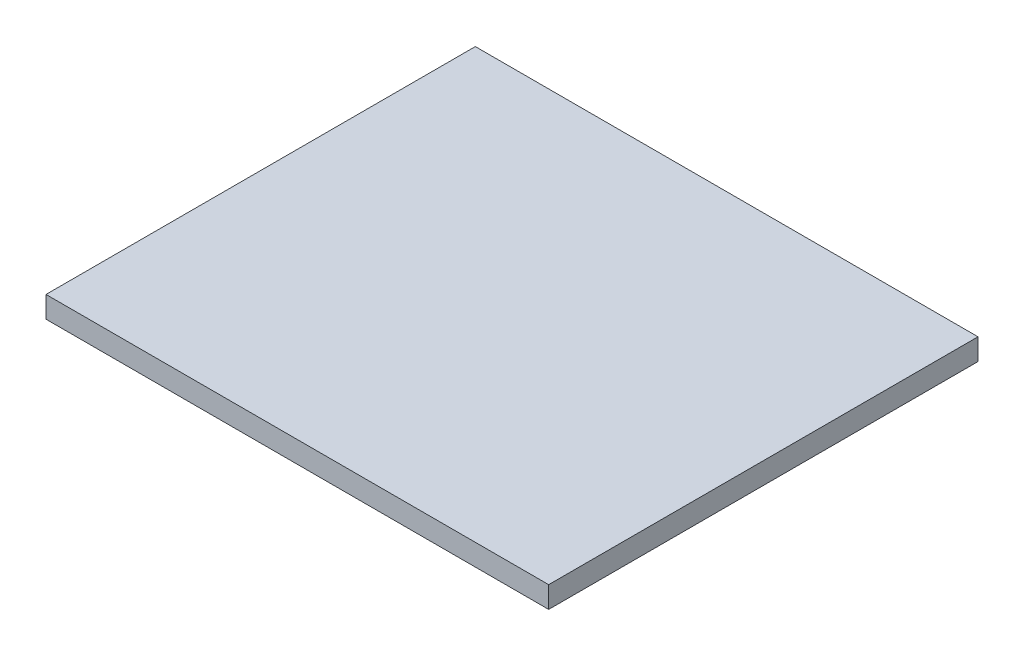
ISO-10303-21;
HEADER;
FILE_DESCRIPTION(('STEP AP214'),'2;1');
FILE_NAME('part.step','',(''),(''),'','','');
FILE_SCHEMA(('AUTOMOTIVE_DESIGN { 1 0 10303 214 1 1 1 1 }'));
ENDSEC;
DATA;
#1=APPLICATION_CONTEXT('core data for automotive mechanical design processes');
#2=APPLICATION_PROTOCOL_DEFINITION('international standard','automotive_design',2000,#1);
#3=PRODUCT_CONTEXT('',#1,'mechanical');
#4=PRODUCT('Part','Part','',(#3));
#5=PRODUCT_RELATED_PRODUCT_CATEGORY('part','',(#4));
#6=PRODUCT_DEFINITION_FORMATION('','',#4);
#7=PRODUCT_DEFINITION_CONTEXT('part definition',#1,'design');
#8=PRODUCT_DEFINITION('design','',#6,#7);
#9=PRODUCT_DEFINITION_SHAPE('','',#8);
#10=(LENGTH_UNIT() NAMED_UNIT(*) SI_UNIT(.MILLI.,.METRE.));
#11=(NAMED_UNIT(*) PLANE_ANGLE_UNIT() SI_UNIT($,.RADIAN.));
#12=(NAMED_UNIT(*) SI_UNIT($,.STERADIAN.) SOLID_ANGLE_UNIT());
#13=UNCERTAINTY_MEASURE_WITH_UNIT(LENGTH_MEASURE(1.E-05),#10,'distance_accuracy_value','');
#14=(GEOMETRIC_REPRESENTATION_CONTEXT(3) GLOBAL_UNCERTAINTY_ASSIGNED_CONTEXT((#13)) GLOBAL_UNIT_ASSIGNED_CONTEXT((#10,
#11,#12)) REPRESENTATION_CONTEXT('',''));
#15=CARTESIAN_POINT('',(0.,0.,0.));
#16=DIRECTION('',(0.,0.,1.));
#17=DIRECTION('',(1.,0.,0.));
#18=AXIS2_PLACEMENT_3D('',#15,#16,#17);
#19=CARTESIAN_POINT('',(140.5,12.,120.));
#20=DIRECTION('',(-1.,0.,0.));
#21=DIRECTION('',(0.,0.,1.));
#22=AXIS2_PLACEMENT_3D('',#19,#20,#21);
#23=PLANE('',#22);
#24=DIRECTION('',(0.,0.,-1.));
#25=VECTOR('',#24,1.);
#26=CARTESIAN_POINT('',(140.5,0.,120.));
#27=LINE('',#26,#25);
#28=CARTESIAN_POINT('',(140.5,0.,120.));
#29=VERTEX_POINT('',#28);
#30=CARTESIAN_POINT('',(140.5,0.,-120.));
#31=VERTEX_POINT('',#30);
#32=EDGE_CURVE('E97',#29,#31,#27,.T.);
#33=ORIENTED_EDGE('',*,*,#32,.T.);
#34=DIRECTION('',(0.,-1.,0.));
#35=VECTOR('',#34,1.);
#36=CARTESIAN_POINT('',(140.5,12.,-120.));
#37=LINE('',#36,#35);
#38=CARTESIAN_POINT('',(140.5,12.,-120.));
#39=VERTEX_POINT('',#38);
#40=EDGE_CURVE('E11',#39,#31,#37,.T.);
#41=ORIENTED_EDGE('',*,*,#40,.F.);
#42=DIRECTION('',(0.,0.,-1.));
#43=VECTOR('',#42,1.);
#44=CARTESIAN_POINT('',(140.5,12.,120.));
#45=LINE('',#44,#43);
#46=CARTESIAN_POINT('',(140.5,12.,120.));
#47=VERTEX_POINT('',#46);
#48=EDGE_CURVE('E85',#47,#39,#45,.T.);
#49=ORIENTED_EDGE('',*,*,#48,.F.);
#50=DIRECTION('',(0.,-1.,0.));
#51=VECTOR('',#50,1.);
#52=CARTESIAN_POINT('',(140.5,12.,120.));
#53=LINE('',#52,#51);
#54=EDGE_CURVE('E93',#47,#29,#53,.T.);
#55=ORIENTED_EDGE('',*,*,#54,.T.);
#56=EDGE_LOOP('',(#33,#41,#49,#55));
#57=FACE_BOUND('',#56,.T.);
#58=ADVANCED_FACE('F34',(#57),#23,.F.);
#59=CARTESIAN_POINT('',(-140.5,12.,-120.));
#60=DIRECTION('',(0.,0.,1.));
#61=DIRECTION('',(1.,0.,0.));
#62=AXIS2_PLACEMENT_3D('',#59,#60,#61);
#63=PLANE('',#62);
#64=DIRECTION('',(-1.,0.,0.));
#65=VECTOR('',#64,1.);
#66=CARTESIAN_POINT('',(-140.5,0.,-120.));
#67=LINE('',#66,#65);
#68=CARTESIAN_POINT('',(-140.5,0.,-120.));
#69=VERTEX_POINT('',#68);
#70=EDGE_CURVE('E89',#31,#69,#67,.T.);
#71=ORIENTED_EDGE('',*,*,#70,.T.);
#72=DIRECTION('',(0.,-1.,0.));
#73=VECTOR('',#72,1.);
#74=CARTESIAN_POINT('',(-140.5,12.,-120.));
#75=LINE('',#74,#73);
#76=CARTESIAN_POINT('',(-140.5,12.,-120.));
#77=VERTEX_POINT('',#76);
#78=EDGE_CURVE('E42',#77,#69,#75,.T.);
#79=ORIENTED_EDGE('',*,*,#78,.F.);
#80=DIRECTION('',(-1.,0.,0.));
#81=VECTOR('',#80,1.);
#82=CARTESIAN_POINT('',(-140.5,12.,-120.));
#83=LINE('',#82,#81);
#84=EDGE_CURVE('E80',#39,#77,#83,.T.);
#85=ORIENTED_EDGE('',*,*,#84,.F.);
#86=ORIENTED_EDGE('',*,*,#40,.T.);
#87=EDGE_LOOP('',(#71,#79,#85,#86));
#88=FACE_BOUND('',#87,.T.);
#89=ADVANCED_FACE('F88',(#88),#63,.F.);
#90=CARTESIAN_POINT('',(-140.5,12.,120.));
#91=DIRECTION('',(1.,0.,0.));
#92=DIRECTION('',(0.,0.,-1.));
#93=AXIS2_PLACEMENT_3D('',#90,#91,#92);
#94=PLANE('',#93);
#95=DIRECTION('',(0.,0.,1.));
#96=VECTOR('',#95,1.);
#97=CARTESIAN_POINT('',(-140.5,0.,120.));
#98=LINE('',#97,#96);
#99=CARTESIAN_POINT('',(-140.5,0.,120.));
#100=VERTEX_POINT('',#99);
#101=EDGE_CURVE('E67',#69,#100,#98,.T.);
#102=ORIENTED_EDGE('',*,*,#101,.T.);
#103=DIRECTION('',(0.,-1.,0.));
#104=VECTOR('',#103,1.);
#105=CARTESIAN_POINT('',(-140.5,12.,120.));
#106=LINE('',#105,#104);
#107=CARTESIAN_POINT('',(-140.5,12.,120.));
#108=VERTEX_POINT('',#107);
#109=EDGE_CURVE('E90',#108,#100,#106,.T.);
#110=ORIENTED_EDGE('',*,*,#109,.F.);
#111=DIRECTION('',(0.,0.,1.));
#112=VECTOR('',#111,1.);
#113=CARTESIAN_POINT('',(-140.5,12.,120.));
#114=LINE('',#113,#112);
#115=EDGE_CURVE('E83',#77,#108,#114,.T.);
#116=ORIENTED_EDGE('',*,*,#115,.F.);
#117=ORIENTED_EDGE('',*,*,#78,.T.);
#118=EDGE_LOOP('',(#102,#110,#116,#117));
#119=FACE_BOUND('',#118,.T.);
#120=ADVANCED_FACE('F91',(#119),#94,.F.);
#121=CARTESIAN_POINT('',(-140.5,12.,120.));
#122=DIRECTION('',(0.,0.,-1.));
#123=DIRECTION('',(-1.,0.,0.));
#124=AXIS2_PLACEMENT_3D('',#121,#122,#123);
#125=PLANE('',#124);
#126=DIRECTION('',(1.,0.,0.));
#127=VECTOR('',#126,1.);
#128=CARTESIAN_POINT('',(-140.5,0.,120.));
#129=LINE('',#128,#127);
#130=EDGE_CURVE('E73',#100,#29,#129,.T.);
#131=ORIENTED_EDGE('',*,*,#130,.T.);
#132=ORIENTED_EDGE('',*,*,#54,.F.);
#133=DIRECTION('',(1.,0.,0.));
#134=VECTOR('',#133,1.);
#135=CARTESIAN_POINT('',(-140.5,12.,120.));
#136=LINE('',#135,#134);
#137=EDGE_CURVE('E50',#108,#47,#136,.T.);
#138=ORIENTED_EDGE('',*,*,#137,.F.);
#139=ORIENTED_EDGE('',*,*,#109,.T.);
#140=EDGE_LOOP('',(#131,#132,#138,#139));
#141=FACE_BOUND('',#140,.T.);
#142=ADVANCED_FACE('F104',(#141),#125,.F.);
#143=CARTESIAN_POINT('',(0.,12.,0.));
#144=DIRECTION('',(0.,-1.,0.));
#145=DIRECTION('',(0.,0.,-1.));
#146=AXIS2_PLACEMENT_3D('',#143,#144,#145);
#147=PLANE('',#146);
#148=ORIENTED_EDGE('',*,*,#48,.T.);
#149=ORIENTED_EDGE('',*,*,#84,.T.);
#150=ORIENTED_EDGE('',*,*,#115,.T.);
#151=ORIENTED_EDGE('',*,*,#137,.T.);
#152=EDGE_LOOP('',(#148,#149,#150,#151));
#153=FACE_BOUND('',#152,.T.);
#154=ADVANCED_FACE('F81',(#153),#147,.F.);
#155=CARTESIAN_POINT('',(0.,0.,0.));
#156=DIRECTION('',(0.,-1.,0.));
#157=DIRECTION('',(0.,0.,-1.));
#158=AXIS2_PLACEMENT_3D('',#155,#156,#157);
#159=PLANE('',#158);
#160=ORIENTED_EDGE('',*,*,#32,.F.);
#161=ORIENTED_EDGE('',*,*,#130,.F.);
#162=ORIENTED_EDGE('',*,*,#101,.F.);
#163=ORIENTED_EDGE('',*,*,#70,.F.);
#164=EDGE_LOOP('',(#160,#161,#162,#163));
#165=FACE_BOUND('',#164,.T.);
#166=ADVANCED_FACE('F107',(#165),#159,.T.);
#167=CLOSED_SHELL('',(#58,#89,#120,#142,#154,#166));
#168=MANIFOLD_SOLID_BREP('B2',#167);
#169=ADVANCED_BREP_SHAPE_REPRESENTATION('',(#18,#168),#14);
#170=SHAPE_DEFINITION_REPRESENTATION(#9,#169);
ENDSEC;
END-ISO-10303-21;
